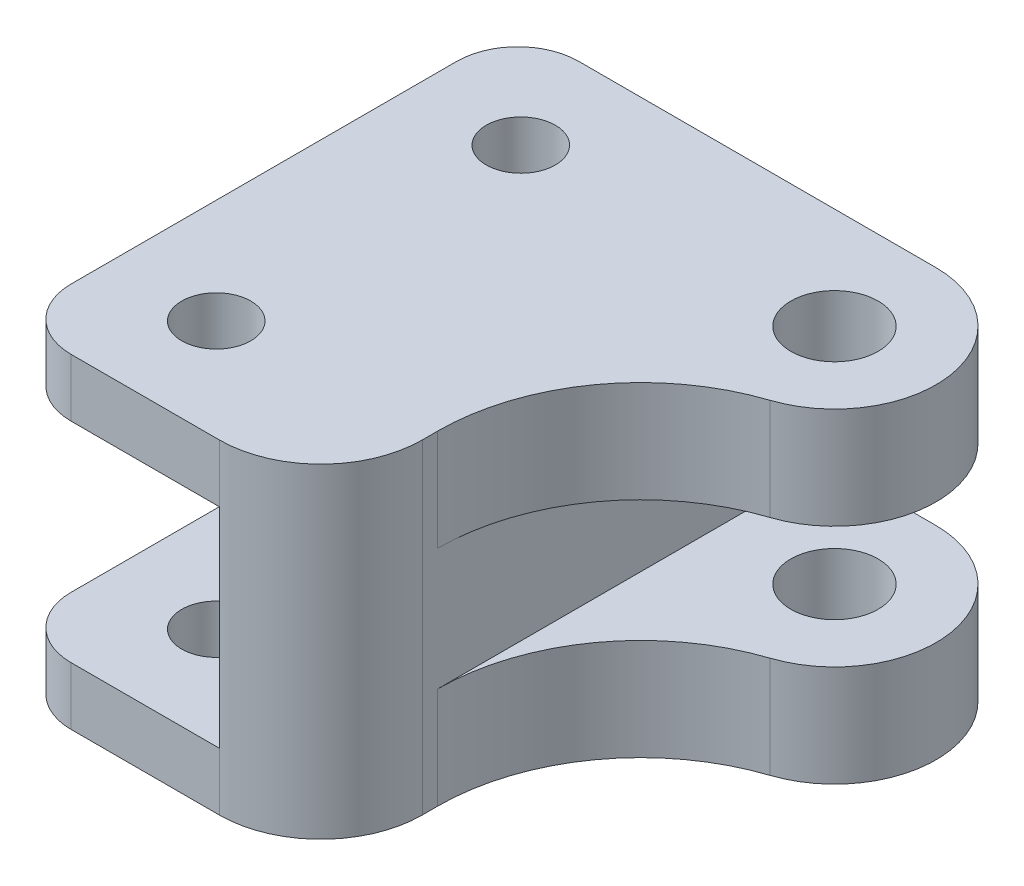
ISO-10303-21;
HEADER;
FILE_DESCRIPTION(('STEP AP214'),'2;1');
FILE_NAME('part.step','',(''),(''),'','','');
FILE_SCHEMA(('AUTOMOTIVE_DESIGN { 1 0 10303 214 1 1 1 1 }'));
ENDSEC;
DATA;
#1=APPLICATION_CONTEXT('core data for automotive mechanical design processes');
#2=APPLICATION_PROTOCOL_DEFINITION('international standard','automotive_design',2000,#1);
#3=PRODUCT_CONTEXT('',#1,'mechanical');
#4=PRODUCT('Part','Part','',(#3));
#5=PRODUCT_RELATED_PRODUCT_CATEGORY('part','',(#4));
#6=PRODUCT_DEFINITION_FORMATION('','',#4);
#7=PRODUCT_DEFINITION_CONTEXT('part definition',#1,'design');
#8=PRODUCT_DEFINITION('design','',#6,#7);
#9=PRODUCT_DEFINITION_SHAPE('','',#8);
#10=(LENGTH_UNIT() NAMED_UNIT(*) SI_UNIT(.MILLI.,.METRE.));
#11=(NAMED_UNIT(*) PLANE_ANGLE_UNIT() SI_UNIT($,.RADIAN.));
#12=(NAMED_UNIT(*) SI_UNIT($,.STERADIAN.) SOLID_ANGLE_UNIT());
#13=UNCERTAINTY_MEASURE_WITH_UNIT(LENGTH_MEASURE(1.E-05),#10,'distance_accuracy_value','');
#14=(GEOMETRIC_REPRESENTATION_CONTEXT(3) GLOBAL_UNCERTAINTY_ASSIGNED_CONTEXT((#13)) GLOBAL_UNIT_ASSIGNED_CONTEXT((#10,
#11,#12)) REPRESENTATION_CONTEXT('',''));
#15=CARTESIAN_POINT('',(0.,0.,0.));
#16=DIRECTION('',(0.,0.,1.));
#17=DIRECTION('',(1.,0.,0.));
#18=AXIS2_PLACEMENT_3D('',#15,#16,#17);
#19=CARTESIAN_POINT('',(0.,0.,25.));
#20=DIRECTION('',(0.,0.,1.));
#21=DIRECTION('',(1.,0.,0.));
#22=AXIS2_PLACEMENT_3D('',#19,#20,#21);
#23=PLANE('',#22);
#24=DIRECTION('',(-1.,0.,0.));
#25=VECTOR('',#24,1.);
#26=CARTESIAN_POINT('',(0.,-5.15,25.));
#27=LINE('',#26,#25);
#28=CARTESIAN_POINT('',(5.15,-5.15,25.));
#29=VERTEX_POINT('',#28);
#30=CARTESIAN_POINT('',(-2.15,-5.15,25.));
#31=VERTEX_POINT('',#30);
#32=EDGE_CURVE('E248',#29,#31,#27,.T.);
#33=ORIENTED_EDGE('',*,*,#32,.T.);
#34=DIRECTION('',(0.,1.,0.));
#35=VECTOR('',#34,1.);
#36=CARTESIAN_POINT('',(-2.15,0.,25.));
#37=LINE('',#36,#35);
#38=CARTESIAN_POINT('',(-2.15,-8.,25.));
#39=VERTEX_POINT('',#38);
#40=EDGE_CURVE('E48',#31,#39,#37,.F.);
#41=ORIENTED_EDGE('',*,*,#40,.T.);
#42=DIRECTION('',(1.,0.,0.));
#43=VECTOR('',#42,1.);
#44=CARTESIAN_POINT('',(0.,-8.,25.));
#45=LINE('',#44,#43);
#46=CARTESIAN_POINT('',(5.15,-8.,25.));
#47=VERTEX_POINT('',#46);
#48=EDGE_CURVE('E251',#39,#47,#45,.T.);
#49=ORIENTED_EDGE('',*,*,#48,.T.);
#50=DIRECTION('',(0.,1.,0.));
#51=VECTOR('',#50,1.);
#52=CARTESIAN_POINT('',(5.15,8.,25.));
#53=LINE('',#52,#51);
#54=EDGE_CURVE('E314',#47,#29,#53,.T.);
#55=ORIENTED_EDGE('',*,*,#54,.T.);
#56=EDGE_LOOP('',(#33,#41,#49,#55));
#57=FACE_BOUND('',#56,.T.);
#58=ADVANCED_FACE('F40',(#57),#23,.T.);
#59=CARTESIAN_POINT('',(0.,0.,0.));
#60=DIRECTION('',(0.,0.,1.));
#61=DIRECTION('',(1.,0.,0.));
#62=AXIS2_PLACEMENT_3D('',#59,#60,#61);
#63=PLANE('',#62);
#64=DIRECTION('',(-1.,0.,0.));
#65=VECTOR('',#64,1.);
#66=CARTESIAN_POINT('',(0.,5.15,0.));
#67=LINE('',#66,#65);
#68=CARTESIAN_POINT('',(5.15,5.15,0.));
#69=VERTEX_POINT('',#68);
#70=CARTESIAN_POINT('',(-2.15,5.15,0.));
#71=VERTEX_POINT('',#70);
#72=EDGE_CURVE('E249',#69,#71,#67,.T.);
#73=ORIENTED_EDGE('',*,*,#72,.T.);
#74=DIRECTION('',(0.,1.,0.));
#75=VECTOR('',#74,1.);
#76=CARTESIAN_POINT('',(-2.15,8.,0.));
#77=LINE('',#76,#75);
#78=CARTESIAN_POINT('',(-2.15,8.,0.));
#79=VERTEX_POINT('',#78);
#80=EDGE_CURVE('E327',#71,#79,#77,.T.);
#81=ORIENTED_EDGE('',*,*,#80,.T.);
#82=DIRECTION('',(1.,0.,0.));
#83=VECTOR('',#82,1.);
#84=CARTESIAN_POINT('',(0.,8.,0.));
#85=LINE('',#84,#83);
#86=CARTESIAN_POINT('',(15.45,8.,0.));
#87=VERTEX_POINT('',#86);
#88=EDGE_CURVE('E266',#79,#87,#85,.T.);
#89=ORIENTED_EDGE('',*,*,#88,.T.);
#90=DIRECTION('',(0.,-1.,0.));
#91=VECTOR('',#90,1.);
#92=CARTESIAN_POINT('',(15.45,8.,0.));
#93=LINE('',#92,#91);
#94=CARTESIAN_POINT('',(15.45,3.,0.));
#95=VERTEX_POINT('',#94);
#96=EDGE_CURVE('E200',#87,#95,#93,.T.);
#97=ORIENTED_EDGE('',*,*,#96,.T.);
#98=DIRECTION('',(1.,0.,0.));
#99=VECTOR('',#98,1.);
#100=CARTESIAN_POINT('',(0.,3.,0.));
#101=LINE('',#100,#99);
#102=CARTESIAN_POINT('',(10.15,3.,0.));
#103=VERTEX_POINT('',#102);
#104=EDGE_CURVE('E191',#103,#95,#101,.T.);
#105=ORIENTED_EDGE('',*,*,#104,.F.);
#106=DIRECTION('',(0.,-1.,0.));
#107=VECTOR('',#106,1.);
#108=CARTESIAN_POINT('',(10.15,0.,0.));
#109=LINE('',#108,#107);
#110=CARTESIAN_POINT('',(10.15,-3.,0.));
#111=VERTEX_POINT('',#110);
#112=EDGE_CURVE('E172',#103,#111,#109,.T.);
#113=ORIENTED_EDGE('',*,*,#112,.T.);
#114=DIRECTION('',(-1.,0.,0.));
#115=VECTOR('',#114,1.);
#116=CARTESIAN_POINT('',(0.,-3.,0.));
#117=LINE('',#116,#115);
#118=CARTESIAN_POINT('',(15.45,-3.,0.));
#119=VERTEX_POINT('',#118);
#120=EDGE_CURVE('E185',#119,#111,#117,.T.);
#121=ORIENTED_EDGE('',*,*,#120,.F.);
#122=CARTESIAN_POINT('',(15.45,-8.,0.));
#123=VERTEX_POINT('',#122);
#124=EDGE_CURVE('E219',#119,#123,#93,.T.);
#125=ORIENTED_EDGE('',*,*,#124,.T.);
#126=DIRECTION('',(1.,0.,0.));
#127=VECTOR('',#126,1.);
#128=CARTESIAN_POINT('',(0.,-8.,0.));
#129=LINE('',#128,#127);
#130=CARTESIAN_POINT('',(-2.15,-8.,0.));
#131=VERTEX_POINT('',#130);
#132=EDGE_CURVE('E264',#131,#123,#129,.T.);
#133=ORIENTED_EDGE('',*,*,#132,.F.);
#134=DIRECTION('',(0.,1.,0.));
#135=VECTOR('',#134,1.);
#136=CARTESIAN_POINT('',(-2.15,-5.15,0.));
#137=LINE('',#136,#135);
#138=CARTESIAN_POINT('',(-2.15,-5.15,0.));
#139=VERTEX_POINT('',#138);
#140=EDGE_CURVE('E324',#131,#139,#137,.T.);
#141=ORIENTED_EDGE('',*,*,#140,.T.);
#142=DIRECTION('',(-1.,0.,0.));
#143=VECTOR('',#142,1.);
#144=CARTESIAN_POINT('',(0.,-5.15,0.));
#145=LINE('',#144,#143);
#146=CARTESIAN_POINT('',(5.15,-5.15,0.));
#147=VERTEX_POINT('',#146);
#148=EDGE_CURVE('E261',#147,#139,#145,.T.);
#149=ORIENTED_EDGE('',*,*,#148,.F.);
#150=DIRECTION('',(0.,-1.,0.));
#151=VECTOR('',#150,1.);
#152=CARTESIAN_POINT('',(5.15,0.,0.));
#153=LINE('',#152,#151);
#154=EDGE_CURVE('E245',#69,#147,#153,.T.);
#155=ORIENTED_EDGE('',*,*,#154,.F.);
#156=EDGE_LOOP('',(#73,#81,#89,#97,#105,#113,#121,#125,#133,#141,#149,#155));
#157=FACE_BOUND('',#156,.T.);
#158=ADVANCED_FACE('F198',(#157),#63,.F.);
#159=CARTESIAN_POINT('',(15.45,8.,5.));
#160=DIRECTION('',(0.,-1.,0.));
#161=DIRECTION('',(0.,0.,-1.));
#162=AXIS2_PLACEMENT_3D('',#159,#160,#161);
#163=CYLINDRICAL_SURFACE('',#162,5.);
#164=CARTESIAN_POINT('',(15.45,-3.,5.));
#165=DIRECTION('',(0.,1.,0.));
#166=DIRECTION('',(0.,0.,1.));
#167=AXIS2_PLACEMENT_3D('',#164,#165,#166);
#168=CIRCLE('',#167,5.);
#169=CARTESIAN_POINT('',(17.0166666666667,-3.,9.74821603926733));
#170=VERTEX_POINT('',#169);
#171=EDGE_CURVE('E205',#119,#170,#168,.F.);
#172=ORIENTED_EDGE('',*,*,#171,.T.);
#173=DIRECTION('',(0.,-1.,0.));
#174=VECTOR('',#173,1.);
#175=CARTESIAN_POINT('',(17.0166666666667,8.,9.74821603926733));
#176=LINE('',#175,#174);
#177=CARTESIAN_POINT('',(17.0166666666667,-8.,9.74821603926733));
#178=VERTEX_POINT('',#177);
#179=EDGE_CURVE('E287',#170,#178,#176,.T.);
#180=ORIENTED_EDGE('',*,*,#179,.T.);
#181=CARTESIAN_POINT('',(15.45,-8.,5.));
#182=DIRECTION('',(0.,-1.,0.));
#183=DIRECTION('',(0.,0.,-1.));
#184=AXIS2_PLACEMENT_3D('',#181,#182,#183);
#185=CIRCLE('',#184,5.);
#186=EDGE_CURVE('E184',#123,#178,#185,.T.);
#187=ORIENTED_EDGE('',*,*,#186,.F.);
#188=ORIENTED_EDGE('',*,*,#124,.F.);
#189=EDGE_LOOP('',(#172,#180,#187,#188));
#190=FACE_BOUND('',#189,.T.);
#191=ADVANCED_FACE('F426',(#190),#163,.T.);
#192=CARTESIAN_POINT('',(15.45,8.,5.));
#193=DIRECTION('',(0.,-1.,0.));
#194=DIRECTION('',(0.,0.,-1.));
#195=AXIS2_PLACEMENT_3D('',#192,#193,#194);
#196=CIRCLE('',#195,5.);
#197=CARTESIAN_POINT('',(17.0166666666667,8.,9.74821603926733));
#198=VERTEX_POINT('',#197);
#199=EDGE_CURVE('E212',#87,#198,#196,.T.);
#200=ORIENTED_EDGE('',*,*,#199,.T.);
#201=DIRECTION('',(0.,-1.,0.));
#202=VECTOR('',#201,1.);
#203=CARTESIAN_POINT('',(17.0166666666667,8.,9.74821603926733));
#204=LINE('',#203,#202);
#205=CARTESIAN_POINT('',(17.0166666666667,3.,9.74821603926733));
#206=VERTEX_POINT('',#205);
#207=EDGE_CURVE('E300',#198,#206,#204,.T.);
#208=ORIENTED_EDGE('',*,*,#207,.T.);
#209=CARTESIAN_POINT('',(15.45,3.,5.));
#210=DIRECTION('',(0.,-1.,0.));
#211=DIRECTION('',(0.,0.,-1.));
#212=AXIS2_PLACEMENT_3D('',#209,#210,#211);
#213=CIRCLE('',#212,5.);
#214=EDGE_CURVE('E202',#206,#95,#213,.F.);
#215=ORIENTED_EDGE('',*,*,#214,.T.);
#216=ORIENTED_EDGE('',*,*,#96,.F.);
#217=EDGE_LOOP('',(#200,#208,#215,#216));
#218=FACE_BOUND('',#217,.T.);
#219=ADVANCED_FACE('F412',(#218),#163,.T.);
#220=CARTESIAN_POINT('',(15.45,8.,5.));
#221=DIRECTION('',(0.,-1.,0.));
#222=DIRECTION('',(0.,0.,-1.));
#223=AXIS2_PLACEMENT_3D('',#220,#221,#222);
#224=CYLINDRICAL_SURFACE('',#223,2.15);
#225=CARTESIAN_POINT('',(15.45,-8.,5.));
#226=DIRECTION('',(0.,-1.,0.));
#227=DIRECTION('',(0.,0.,-1.));
#228=AXIS2_PLACEMENT_3D('',#225,#226,#227);
#229=CIRCLE('',#228,2.15);
#230=CARTESIAN_POINT('',(15.45,-8.,2.85));
#231=VERTEX_POINT('',#230);
#232=EDGE_CURVE('E216',#231,#231,#229,.T.);
#233=ORIENTED_EDGE('',*,*,#232,.T.);
#234=EDGE_LOOP('',(#233));
#235=FACE_BOUND('',#234,.T.);
#236=CARTESIAN_POINT('',(15.45,-3.,5.));
#237=DIRECTION('',(0.,1.,0.));
#238=DIRECTION('',(0.,0.,1.));
#239=AXIS2_PLACEMENT_3D('',#236,#237,#238);
#240=CIRCLE('',#239,2.15);
#241=CARTESIAN_POINT('',(15.45,-3.,7.15));
#242=VERTEX_POINT('',#241);
#243=EDGE_CURVE('E201',#242,#242,#240,.F.);
#244=ORIENTED_EDGE('',*,*,#243,.F.);
#245=EDGE_LOOP('',(#244));
#246=FACE_BOUND('',#245,.T.);
#247=ADVANCED_FACE('F433',(#235,#246),#224,.F.);
#248=CARTESIAN_POINT('',(15.45,8.,5.));
#249=DIRECTION('',(0.,-1.,0.));
#250=DIRECTION('',(0.,0.,-1.));
#251=AXIS2_PLACEMENT_3D('',#248,#249,#250);
#252=CIRCLE('',#251,2.15);
#253=CARTESIAN_POINT('',(15.45,8.,2.85));
#254=VERTEX_POINT('',#253);
#255=EDGE_CURVE('E215',#254,#254,#252,.T.);
#256=ORIENTED_EDGE('',*,*,#255,.F.);
#257=EDGE_LOOP('',(#256));
#258=FACE_BOUND('',#257,.T.);
#259=CARTESIAN_POINT('',(15.45,3.,5.));
#260=DIRECTION('',(0.,-1.,0.));
#261=DIRECTION('',(0.,0.,-1.));
#262=AXIS2_PLACEMENT_3D('',#259,#260,#261);
#263=CIRCLE('',#262,2.15);
#264=CARTESIAN_POINT('',(15.45,3.,2.85));
#265=VERTEX_POINT('',#264);
#266=EDGE_CURVE('E195',#265,#265,#263,.F.);
#267=ORIENTED_EDGE('',*,*,#266,.F.);
#268=EDGE_LOOP('',(#267));
#269=FACE_BOUND('',#268,.T.);
#270=ADVANCED_FACE('F465',(#258,#269),#224,.F.);
#271=CARTESIAN_POINT('',(10.15,0.,25.));
#272=DIRECTION('',(-1.,0.,0.));
#273=DIRECTION('',(0.,-1.,0.));
#274=AXIS2_PLACEMENT_3D('',#271,#272,#273);
#275=PLANE('',#274);
#276=DIRECTION('',(0.,0.,-1.));
#277=VECTOR('',#276,1.);
#278=CARTESIAN_POINT('',(10.15,8.,25.));
#279=LINE('',#278,#277);
#280=CARTESIAN_POINT('',(10.15,8.,20.));
#281=VERTEX_POINT('',#280);
#282=CARTESIAN_POINT('',(10.15,8.,19.244648117802));
#283=VERTEX_POINT('',#282);
#284=EDGE_CURVE('E276',#281,#283,#279,.T.);
#285=ORIENTED_EDGE('',*,*,#284,.F.);
#286=DIRECTION('',(0.,1.,0.));
#287=VECTOR('',#286,1.);
#288=CARTESIAN_POINT('',(10.15,-8.,20.));
#289=LINE('',#288,#287);
#290=CARTESIAN_POINT('',(10.15,-8.,20.));
#291=VERTEX_POINT('',#290);
#292=EDGE_CURVE('E319',#281,#291,#289,.F.);
#293=ORIENTED_EDGE('',*,*,#292,.T.);
#294=DIRECTION('',(0.,0.,-1.));
#295=VECTOR('',#294,1.);
#296=CARTESIAN_POINT('',(10.15,-8.,25.));
#297=LINE('',#296,#295);
#298=CARTESIAN_POINT('',(10.15,-8.,19.244648117802));
#299=VERTEX_POINT('',#298);
#300=EDGE_CURVE('E278',#291,#299,#297,.T.);
#301=ORIENTED_EDGE('',*,*,#300,.T.);
#302=DIRECTION('',(0.,-1.,0.));
#303=VECTOR('',#302,1.);
#304=CARTESIAN_POINT('',(10.15,0.,19.244648117802));
#305=LINE('',#304,#303);
#306=CARTESIAN_POINT('',(10.15,-3.,19.244648117802));
#307=VERTEX_POINT('',#306);
#308=EDGE_CURVE('E298',#299,#307,#305,.F.);
#309=ORIENTED_EDGE('',*,*,#308,.T.);
#310=DIRECTION('',(0.,0.,-1.));
#311=VECTOR('',#310,1.);
#312=CARTESIAN_POINT('',(10.15,-3.,-10.));
#313=LINE('',#312,#311);
#314=EDGE_CURVE('E180',#307,#111,#313,.T.);
#315=ORIENTED_EDGE('',*,*,#314,.T.);
#316=ORIENTED_EDGE('',*,*,#112,.F.);
#317=DIRECTION('',(0.,0.,1.));
#318=VECTOR('',#317,1.);
#319=CARTESIAN_POINT('',(10.15,3.,-10.));
#320=LINE('',#319,#318);
#321=CARTESIAN_POINT('',(10.15,3.,19.244648117802));
#322=VERTEX_POINT('',#321);
#323=EDGE_CURVE('E177',#103,#322,#320,.T.);
#324=ORIENTED_EDGE('',*,*,#323,.T.);
#325=DIRECTION('',(0.,-1.,0.));
#326=VECTOR('',#325,1.);
#327=CARTESIAN_POINT('',(10.15,0.,19.244648117802));
#328=LINE('',#327,#326);
#329=EDGE_CURVE('E296',#322,#283,#328,.F.);
#330=ORIENTED_EDGE('',*,*,#329,.T.);
#331=EDGE_LOOP('',(#285,#293,#301,#309,#315,#316,#324,#330));
#332=FACE_BOUND('',#331,.T.);
#333=ADVANCED_FACE('F175',(#332),#275,.F.);
#334=CARTESIAN_POINT('',(5.15,0.,25.));
#335=DIRECTION('',(1.,0.,0.));
#336=DIRECTION('',(0.,1.,0.));
#337=AXIS2_PLACEMENT_3D('',#334,#335,#336);
#338=PLANE('',#337);
#339=ORIENTED_EDGE('',*,*,#154,.T.);
#340=DIRECTION('',(0.,0.,-1.));
#341=VECTOR('',#340,1.);
#342=CARTESIAN_POINT('',(5.15,-5.15,25.));
#343=LINE('',#342,#341);
#344=EDGE_CURVE('E284',#29,#147,#343,.T.);
#345=ORIENTED_EDGE('',*,*,#344,.F.);
#346=DIRECTION('',(0.,-1.,0.));
#347=VECTOR('',#346,1.);
#348=CARTESIAN_POINT('',(5.15,0.,25.));
#349=LINE('',#348,#347);
#350=CARTESIAN_POINT('',(5.15,5.15,25.));
#351=VERTEX_POINT('',#350);
#352=EDGE_CURVE('E246',#351,#29,#349,.T.);
#353=ORIENTED_EDGE('',*,*,#352,.F.);
#354=DIRECTION('',(0.,0.,-1.));
#355=VECTOR('',#354,1.);
#356=CARTESIAN_POINT('',(5.15,5.15,25.));
#357=LINE('',#356,#355);
#358=EDGE_CURVE('E258',#351,#69,#357,.T.);
#359=ORIENTED_EDGE('',*,*,#358,.T.);
#360=EDGE_LOOP('',(#339,#345,#353,#359));
#361=FACE_BOUND('',#360,.T.);
#362=ADVANCED_FACE('F385',(#361),#338,.F.);
#363=CARTESIAN_POINT('',(0.,-5.15,25.));
#364=DIRECTION('',(0.,-1.,0.));
#365=DIRECTION('',(1.,0.,0.));
#366=AXIS2_PLACEMENT_3D('',#363,#364,#365);
#367=PLANE('',#366);
#368=CARTESIAN_POINT('',(0.,-5.15,20.));
#369=DIRECTION('',(0.,-1.,0.));
#370=DIRECTION('',(1.,0.,0.));
#371=AXIS2_PLACEMENT_3D('',#368,#369,#370);
#372=CIRCLE('',#371,1.7);
#373=CARTESIAN_POINT('',(1.7,-5.15,20.));
#374=VERTEX_POINT('',#373);
#375=EDGE_CURVE('E242',#374,#374,#372,.T.);
#376=ORIENTED_EDGE('',*,*,#375,.T.);
#377=EDGE_LOOP('',(#376));
#378=FACE_BOUND('',#377,.T.);
#379=CARTESIAN_POINT('',(0.,-5.15,5.));
#380=DIRECTION('',(0.,-1.,0.));
#381=DIRECTION('',(1.,0.,0.));
#382=AXIS2_PLACEMENT_3D('',#379,#380,#381);
#383=CIRCLE('',#382,1.7);
#384=CARTESIAN_POINT('',(1.7,-5.15,5.));
#385=VERTEX_POINT('',#384);
#386=EDGE_CURVE('E238',#385,#385,#383,.T.);
#387=ORIENTED_EDGE('',*,*,#386,.T.);
#388=EDGE_LOOP('',(#387));
#389=FACE_BOUND('',#388,.T.);
#390=ORIENTED_EDGE('',*,*,#148,.T.);
#391=CARTESIAN_POINT('',(-2.15,-5.15,3.));
#392=DIRECTION('',(0.,-1.,0.));
#393=DIRECTION('',(1.,0.,0.));
#394=AXIS2_PLACEMENT_3D('',#391,#392,#393);
#395=CIRCLE('',#394,3.);
#396=CARTESIAN_POINT('',(-5.15,-5.15,3.));
#397=VERTEX_POINT('',#396);
#398=EDGE_CURVE('E345',#139,#397,#395,.F.);
#399=ORIENTED_EDGE('',*,*,#398,.T.);
#400=DIRECTION('',(0.,0.,-1.));
#401=VECTOR('',#400,1.);
#402=CARTESIAN_POINT('',(-5.15,-5.15,25.));
#403=LINE('',#402,#401);
#404=CARTESIAN_POINT('',(-5.15,-5.15,22.));
#405=VERTEX_POINT('',#404);
#406=EDGE_CURVE('E282',#405,#397,#403,.T.);
#407=ORIENTED_EDGE('',*,*,#406,.F.);
#408=CARTESIAN_POINT('',(-2.15,-5.15,22.));
#409=DIRECTION('',(0.,-1.,0.));
#410=DIRECTION('',(1.,0.,0.));
#411=AXIS2_PLACEMENT_3D('',#408,#409,#410);
#412=CIRCLE('',#411,3.);
#413=EDGE_CURVE('E343',#405,#31,#412,.F.);
#414=ORIENTED_EDGE('',*,*,#413,.T.);
#415=ORIENTED_EDGE('',*,*,#32,.F.);
#416=ORIENTED_EDGE('',*,*,#344,.T.);
#417=EDGE_LOOP('',(#390,#399,#407,#414,#415,#416));
#418=FACE_BOUND('',#417,.T.);
#419=ADVANCED_FACE('F367',(#378,#389,#418),#367,.F.);
#420=CARTESIAN_POINT('',(-5.15,0.,25.));
#421=DIRECTION('',(-1.,0.,0.));
#422=DIRECTION('',(0.,-1.,0.));
#423=AXIS2_PLACEMENT_3D('',#420,#421,#422);
#424=PLANE('',#423);
#425=ORIENTED_EDGE('',*,*,#406,.T.);
#426=DIRECTION('',(0.,1.,0.));
#427=VECTOR('',#426,1.);
#428=CARTESIAN_POINT('',(-5.15,-8.,3.));
#429=LINE('',#428,#427);
#430=CARTESIAN_POINT('',(-5.15,-8.,3.));
#431=VERTEX_POINT('',#430);
#432=EDGE_CURVE('E62',#397,#431,#429,.F.);
#433=ORIENTED_EDGE('',*,*,#432,.T.);
#434=DIRECTION('',(0.,0.,-1.));
#435=VECTOR('',#434,1.);
#436=CARTESIAN_POINT('',(-5.15,-8.,25.));
#437=LINE('',#436,#435);
#438=CARTESIAN_POINT('',(-5.15,-8.,22.));
#439=VERTEX_POINT('',#438);
#440=EDGE_CURVE('E280',#439,#431,#437,.T.);
#441=ORIENTED_EDGE('',*,*,#440,.F.);
#442=DIRECTION('',(0.,1.,0.));
#443=VECTOR('',#442,1.);
#444=CARTESIAN_POINT('',(-5.15,0.,22.));
#445=LINE('',#444,#443);
#446=EDGE_CURVE('E347',#439,#405,#445,.T.);
#447=ORIENTED_EDGE('',*,*,#446,.T.);
#448=EDGE_LOOP('',(#425,#433,#441,#447));
#449=FACE_BOUND('',#448,.T.);
#450=ADVANCED_FACE('F368',(#449),#424,.T.);
#451=CARTESIAN_POINT('',(0.,-8.,25.));
#452=DIRECTION('',(0.,1.,0.));
#453=DIRECTION('',(0.,0.,1.));
#454=AXIS2_PLACEMENT_3D('',#451,#452,#453);
#455=PLANE('',#454);
#456=CARTESIAN_POINT('',(0.,-8.,20.));
#457=DIRECTION('',(0.,-1.,0.));
#458=DIRECTION('',(0.,0.,-1.));
#459=AXIS2_PLACEMENT_3D('',#456,#457,#458);
#460=CIRCLE('',#459,1.7);
#461=CARTESIAN_POINT('',(0.,-8.,18.3));
#462=VERTEX_POINT('',#461);
#463=EDGE_CURVE('E230',#462,#462,#460,.T.);
#464=ORIENTED_EDGE('',*,*,#463,.F.);
#465=EDGE_LOOP('',(#464));
#466=FACE_BOUND('',#465,.T.);
#467=CARTESIAN_POINT('',(0.,-8.,5.));
#468=DIRECTION('',(0.,-1.,0.));
#469=DIRECTION('',(0.,0.,-1.));
#470=AXIS2_PLACEMENT_3D('',#467,#468,#469);
#471=CIRCLE('',#470,1.7);
#472=CARTESIAN_POINT('',(0.,-8.,3.3));
#473=VERTEX_POINT('',#472);
#474=EDGE_CURVE('E233',#473,#473,#471,.T.);
#475=ORIENTED_EDGE('',*,*,#474,.F.);
#476=EDGE_LOOP('',(#475));
#477=FACE_BOUND('',#476,.T.);
#478=ORIENTED_EDGE('',*,*,#440,.T.);
#479=CARTESIAN_POINT('',(-2.15,-8.,3.));
#480=DIRECTION('',(0.,1.,0.));
#481=DIRECTION('',(0.,0.,1.));
#482=AXIS2_PLACEMENT_3D('',#479,#480,#481);
#483=CIRCLE('',#482,3.);
#484=EDGE_CURVE('E353',#431,#131,#483,.F.);
#485=ORIENTED_EDGE('',*,*,#484,.T.);
#486=ORIENTED_EDGE('',*,*,#132,.T.);
#487=ORIENTED_EDGE('',*,*,#186,.T.);
#488=CARTESIAN_POINT('',(20.15,-8.,19.244648117802));
#489=DIRECTION('',(0.,1.,0.));
#490=DIRECTION('',(0.,0.,1.));
#491=AXIS2_PLACEMENT_3D('',#488,#489,#490);
#492=CIRCLE('',#491,10.);
#493=EDGE_CURVE('E303',#178,#299,#492,.T.);
#494=ORIENTED_EDGE('',*,*,#493,.T.);
#495=ORIENTED_EDGE('',*,*,#300,.F.);
#496=CARTESIAN_POINT('',(5.15,-8.,20.));
#497=DIRECTION('',(0.,1.,0.));
#498=DIRECTION('',(0.,0.,1.));
#499=AXIS2_PLACEMENT_3D('',#496,#497,#498);
#500=CIRCLE('',#499,5.);
#501=EDGE_CURVE('E321',#291,#47,#500,.F.);
#502=ORIENTED_EDGE('',*,*,#501,.T.);
#503=ORIENTED_EDGE('',*,*,#48,.F.);
#504=CARTESIAN_POINT('',(-2.15,-8.,22.));
#505=DIRECTION('',(0.,1.,0.));
#506=DIRECTION('',(0.,0.,1.));
#507=AXIS2_PLACEMENT_3D('',#504,#505,#506);
#508=CIRCLE('',#507,3.);
#509=EDGE_CURVE('E351',#39,#439,#508,.F.);
#510=ORIENTED_EDGE('',*,*,#509,.T.);
#511=EDGE_LOOP('',(#478,#485,#486,#487,#494,#495,#502,#503,#510));
#512=FACE_BOUND('',#511,.T.);
#513=ORIENTED_EDGE('',*,*,#232,.F.);
#514=EDGE_LOOP('',(#513));
#515=FACE_BOUND('',#514,.T.);
#516=ADVANCED_FACE('F357',(#466,#477,#512,#515),#455,.F.);
#517=CARTESIAN_POINT('',(0.,8.,25.));
#518=DIRECTION('',(0.,1.,0.));
#519=DIRECTION('',(-1.,0.,0.));
#520=AXIS2_PLACEMENT_3D('',#517,#518,#519);
#521=PLANE('',#520);
#522=CARTESIAN_POINT('',(0.,8.,20.));
#523=DIRECTION('',(0.,-1.,0.));
#524=DIRECTION('',(0.,0.,-1.));
#525=AXIS2_PLACEMENT_3D('',#522,#523,#524);
#526=CIRCLE('',#525,1.7);
#527=CARTESIAN_POINT('',(0.,8.,18.3));
#528=VERTEX_POINT('',#527);
#529=EDGE_CURVE('E226',#528,#528,#526,.T.);
#530=ORIENTED_EDGE('',*,*,#529,.T.);
#531=EDGE_LOOP('',(#530));
#532=FACE_BOUND('',#531,.T.);
#533=CARTESIAN_POINT('',(0.,8.,5.));
#534=DIRECTION('',(0.,-1.,0.));
#535=DIRECTION('',(0.,0.,-1.));
#536=AXIS2_PLACEMENT_3D('',#533,#534,#535);
#537=CIRCLE('',#536,1.7);
#538=CARTESIAN_POINT('',(0.,8.,3.3));
#539=VERTEX_POINT('',#538);
#540=EDGE_CURVE('E225',#539,#539,#537,.T.);
#541=ORIENTED_EDGE('',*,*,#540,.T.);
#542=EDGE_LOOP('',(#541));
#543=FACE_BOUND('',#542,.T.);
#544=ORIENTED_EDGE('',*,*,#88,.F.);
#545=CARTESIAN_POINT('',(-2.15,8.,3.));
#546=DIRECTION('',(0.,1.,0.));
#547=DIRECTION('',(-1.,0.,0.));
#548=AXIS2_PLACEMENT_3D('',#545,#546,#547);
#549=CIRCLE('',#548,3.);
#550=CARTESIAN_POINT('',(-5.15,8.,3.));
#551=VERTEX_POINT('',#550);
#552=EDGE_CURVE('E332',#79,#551,#549,.T.);
#553=ORIENTED_EDGE('',*,*,#552,.T.);
#554=DIRECTION('',(0.,0.,-1.));
#555=VECTOR('',#554,1.);
#556=CARTESIAN_POINT('',(-5.15,8.,25.));
#557=LINE('',#556,#555);
#558=CARTESIAN_POINT('',(-5.15,8.,22.));
#559=VERTEX_POINT('',#558);
#560=EDGE_CURVE('E273',#559,#551,#557,.T.);
#561=ORIENTED_EDGE('',*,*,#560,.F.);
#562=CARTESIAN_POINT('',(-2.15,8.,22.));
#563=DIRECTION('',(0.,1.,0.));
#564=DIRECTION('',(-1.,0.,0.));
#565=AXIS2_PLACEMENT_3D('',#562,#563,#564);
#566=CIRCLE('',#565,3.);
#567=CARTESIAN_POINT('',(-2.15,8.,25.));
#568=VERTEX_POINT('',#567);
#569=EDGE_CURVE('E330',#559,#568,#566,.T.);
#570=ORIENTED_EDGE('',*,*,#569,.T.);
#571=DIRECTION('',(1.,0.,0.));
#572=VECTOR('',#571,1.);
#573=CARTESIAN_POINT('',(0.,8.,25.));
#574=LINE('',#573,#572);
#575=CARTESIAN_POINT('',(5.15,8.,25.));
#576=VERTEX_POINT('',#575);
#577=EDGE_CURVE('E253',#568,#576,#574,.T.);
#578=ORIENTED_EDGE('',*,*,#577,.T.);
#579=CARTESIAN_POINT('',(5.15,8.,20.));
#580=DIRECTION('',(0.,1.,0.));
#581=DIRECTION('',(-1.,0.,0.));
#582=AXIS2_PLACEMENT_3D('',#579,#580,#581);
#583=CIRCLE('',#582,5.);
#584=EDGE_CURVE('E317',#576,#281,#583,.T.);
#585=ORIENTED_EDGE('',*,*,#584,.T.);
#586=ORIENTED_EDGE('',*,*,#284,.T.);
#587=CARTESIAN_POINT('',(20.15,8.00000000000001,19.244648117802));
#588=DIRECTION('',(0.,1.,0.));
#589=DIRECTION('',(-1.,0.,0.));
#590=AXIS2_PLACEMENT_3D('',#587,#588,#589);
#591=CIRCLE('',#590,10.);
#592=EDGE_CURVE('E309',#283,#198,#591,.F.);
#593=ORIENTED_EDGE('',*,*,#592,.T.);
#594=ORIENTED_EDGE('',*,*,#199,.F.);
#595=EDGE_LOOP('',(#544,#553,#561,#570,#578,#585,#586,#593,#594));
#596=FACE_BOUND('',#595,.T.);
#597=ORIENTED_EDGE('',*,*,#255,.T.);
#598=EDGE_LOOP('',(#597));
#599=FACE_BOUND('',#598,.T.);
#600=ADVANCED_FACE('F404',(#532,#543,#596,#599),#521,.T.);
#601=CARTESIAN_POINT('',(-5.15,0.,25.));
#602=DIRECTION('',(-1.,0.,0.));
#603=DIRECTION('',(0.,-1.,0.));
#604=AXIS2_PLACEMENT_3D('',#601,#602,#603);
#605=PLANE('',#604);
#606=ORIENTED_EDGE('',*,*,#560,.T.);
#607=DIRECTION('',(0.,1.,0.));
#608=VECTOR('',#607,1.);
#609=CARTESIAN_POINT('',(-5.15,5.15,3.));
#610=LINE('',#609,#608);
#611=CARTESIAN_POINT('',(-5.15,5.15,3.));
#612=VERTEX_POINT('',#611);
#613=EDGE_CURVE('E337',#551,#612,#610,.F.);
#614=ORIENTED_EDGE('',*,*,#613,.T.);
#615=DIRECTION('',(0.,0.,-1.));
#616=VECTOR('',#615,1.);
#617=CARTESIAN_POINT('',(-5.15,5.15,25.));
#618=LINE('',#617,#616);
#619=CARTESIAN_POINT('',(-5.15,5.15,22.));
#620=VERTEX_POINT('',#619);
#621=EDGE_CURVE('E270',#620,#612,#618,.T.);
#622=ORIENTED_EDGE('',*,*,#621,.F.);
#623=DIRECTION('',(0.,1.,0.));
#624=VECTOR('',#623,1.);
#625=CARTESIAN_POINT('',(-5.15,0.,22.));
#626=LINE('',#625,#624);
#627=EDGE_CURVE('E334',#620,#559,#626,.T.);
#628=ORIENTED_EDGE('',*,*,#627,.T.);
#629=EDGE_LOOP('',(#606,#614,#622,#628));
#630=FACE_BOUND('',#629,.T.);
#631=ADVANCED_FACE('F400',(#630),#605,.T.);
#632=CARTESIAN_POINT('',(0.,5.15,25.));
#633=DIRECTION('',(0.,-1.,0.));
#634=DIRECTION('',(1.,0.,0.));
#635=AXIS2_PLACEMENT_3D('',#632,#633,#634);
#636=PLANE('',#635);
#637=CARTESIAN_POINT('',(0.,5.15,20.));
#638=DIRECTION('',(0.,-1.,0.));
#639=DIRECTION('',(1.,0.,0.));
#640=AXIS2_PLACEMENT_3D('',#637,#638,#639);
#641=CIRCLE('',#640,1.7);
#642=CARTESIAN_POINT('',(1.7,5.15,20.));
#643=VERTEX_POINT('',#642);
#644=EDGE_CURVE('E241',#643,#643,#641,.T.);
#645=ORIENTED_EDGE('',*,*,#644,.F.);
#646=EDGE_LOOP('',(#645));
#647=FACE_BOUND('',#646,.T.);
#648=CARTESIAN_POINT('',(0.,5.15,5.));
#649=DIRECTION('',(0.,-1.,0.));
#650=DIRECTION('',(1.,0.,0.));
#651=AXIS2_PLACEMENT_3D('',#648,#649,#650);
#652=CIRCLE('',#651,1.7);
#653=CARTESIAN_POINT('',(1.7,5.15,5.));
#654=VERTEX_POINT('',#653);
#655=EDGE_CURVE('E229',#654,#654,#652,.T.);
#656=ORIENTED_EDGE('',*,*,#655,.F.);
#657=EDGE_LOOP('',(#656));
#658=FACE_BOUND('',#657,.T.);
#659=ORIENTED_EDGE('',*,*,#621,.T.);
#660=CARTESIAN_POINT('',(-2.15,5.15,3.));
#661=DIRECTION('',(0.,-1.,0.));
#662=DIRECTION('',(1.,0.,0.));
#663=AXIS2_PLACEMENT_3D('',#660,#661,#662);
#664=CIRCLE('',#663,3.);
#665=EDGE_CURVE('E341',#612,#71,#664,.T.);
#666=ORIENTED_EDGE('',*,*,#665,.T.);
#667=ORIENTED_EDGE('',*,*,#72,.F.);
#668=ORIENTED_EDGE('',*,*,#358,.F.);
#669=DIRECTION('',(-1.,0.,0.));
#670=VECTOR('',#669,1.);
#671=CARTESIAN_POINT('',(0.,5.15,25.));
#672=LINE('',#671,#670);
#673=CARTESIAN_POINT('',(-2.15,5.15,25.));
#674=VERTEX_POINT('',#673);
#675=EDGE_CURVE('E255',#351,#674,#672,.T.);
#676=ORIENTED_EDGE('',*,*,#675,.T.);
#677=CARTESIAN_POINT('',(-2.15,5.15,22.));
#678=DIRECTION('',(0.,-1.,0.));
#679=DIRECTION('',(1.,0.,0.));
#680=AXIS2_PLACEMENT_3D('',#677,#678,#679);
#681=CIRCLE('',#680,3.);
#682=EDGE_CURVE('E339',#674,#620,#681,.T.);
#683=ORIENTED_EDGE('',*,*,#682,.T.);
#684=EDGE_LOOP('',(#659,#666,#667,#668,#676,#683));
#685=FACE_BOUND('',#684,.T.);
#686=ADVANCED_FACE('F393',(#647,#658,#685),#636,.T.);
#687=ORIENTED_EDGE('',*,*,#577,.F.);
#688=DIRECTION('',(0.,1.,0.));
#689=VECTOR('',#688,1.);
#690=CARTESIAN_POINT('',(-2.15,0.,25.));
#691=LINE('',#690,#689);
#692=EDGE_CURVE('E11',#568,#674,#691,.F.);
#693=ORIENTED_EDGE('',*,*,#692,.T.);
#694=ORIENTED_EDGE('',*,*,#675,.F.);
#695=DIRECTION('',(0.,1.,0.));
#696=VECTOR('',#695,1.);
#697=CARTESIAN_POINT('',(5.15,8.,25.));
#698=LINE('',#697,#696);
#699=EDGE_CURVE('E311',#351,#576,#698,.T.);
#700=ORIENTED_EDGE('',*,*,#699,.T.);
#701=EDGE_LOOP('',(#687,#693,#694,#700));
#702=FACE_BOUND('',#701,.T.);
#703=ADVANCED_FACE('F389',(#702),#23,.T.);
#704=CARTESIAN_POINT('',(0.,8.,5.));
#705=DIRECTION('',(0.,-1.,0.));
#706=DIRECTION('',(0.,0.,-1.));
#707=AXIS2_PLACEMENT_3D('',#704,#705,#706);
#708=CYLINDRICAL_SURFACE('',#707,1.7);
#709=ORIENTED_EDGE('',*,*,#655,.T.);
#710=EDGE_LOOP('',(#709));
#711=FACE_BOUND('',#710,.T.);
#712=ORIENTED_EDGE('',*,*,#540,.F.);
#713=EDGE_LOOP('',(#712));
#714=FACE_BOUND('',#713,.T.);
#715=ADVANCED_FACE('F443',(#711,#714),#708,.F.);
#716=CARTESIAN_POINT('',(0.,8.,20.));
#717=DIRECTION('',(0.,-1.,0.));
#718=DIRECTION('',(0.,0.,-1.));
#719=AXIS2_PLACEMENT_3D('',#716,#717,#718);
#720=CYLINDRICAL_SURFACE('',#719,1.7);
#721=ORIENTED_EDGE('',*,*,#644,.T.);
#722=EDGE_LOOP('',(#721));
#723=FACE_BOUND('',#722,.T.);
#724=ORIENTED_EDGE('',*,*,#529,.F.);
#725=EDGE_LOOP('',(#724));
#726=FACE_BOUND('',#725,.T.);
#727=ADVANCED_FACE('F448',(#723,#726),#720,.F.);
#728=ORIENTED_EDGE('',*,*,#474,.T.);
#729=EDGE_LOOP('',(#728));
#730=FACE_BOUND('',#729,.T.);
#731=ORIENTED_EDGE('',*,*,#386,.F.);
#732=EDGE_LOOP('',(#731));
#733=FACE_BOUND('',#732,.T.);
#734=ADVANCED_FACE('F450',(#730,#733),#708,.F.);
#735=ORIENTED_EDGE('',*,*,#463,.T.);
#736=EDGE_LOOP('',(#735));
#737=FACE_BOUND('',#736,.T.);
#738=ORIENTED_EDGE('',*,*,#375,.F.);
#739=EDGE_LOOP('',(#738));
#740=FACE_BOUND('',#739,.T.);
#741=ADVANCED_FACE('F615',(#737,#740),#720,.F.);
#742=CARTESIAN_POINT('',(20.45,-3.,-10.));
#743=DIRECTION('',(0.,1.,0.));
#744=DIRECTION('',(0.,0.,1.));
#745=AXIS2_PLACEMENT_3D('',#742,#743,#744);
#746=PLANE('',#745);
#747=ORIENTED_EDGE('',*,*,#243,.T.);
#748=EDGE_LOOP('',(#747));
#749=FACE_BOUND('',#748,.T.);
#750=ORIENTED_EDGE('',*,*,#120,.T.);
#751=ORIENTED_EDGE('',*,*,#314,.F.);
#752=CARTESIAN_POINT('',(20.15,-3.,19.244648117802));
#753=DIRECTION('',(0.,1.,0.));
#754=DIRECTION('',(0.,0.,1.));
#755=AXIS2_PLACEMENT_3D('',#752,#753,#754);
#756=CIRCLE('',#755,10.);
#757=EDGE_CURVE('E306',#307,#170,#756,.F.);
#758=ORIENTED_EDGE('',*,*,#757,.T.);
#759=ORIENTED_EDGE('',*,*,#171,.F.);
#760=EDGE_LOOP('',(#750,#751,#758,#759));
#761=FACE_BOUND('',#760,.T.);
#762=ADVANCED_FACE('F424',(#749,#761),#746,.T.);
#763=CARTESIAN_POINT('',(20.45,3.,-10.));
#764=DIRECTION('',(0.,-1.,0.));
#765=DIRECTION('',(0.,0.,-1.));
#766=AXIS2_PLACEMENT_3D('',#763,#764,#765);
#767=PLANE('',#766);
#768=ORIENTED_EDGE('',*,*,#266,.T.);
#769=EDGE_LOOP('',(#768));
#770=FACE_BOUND('',#769,.T.);
#771=ORIENTED_EDGE('',*,*,#104,.T.);
#772=ORIENTED_EDGE('',*,*,#214,.F.);
#773=CARTESIAN_POINT('',(20.15,3.,19.244648117802));
#774=DIRECTION('',(0.,-1.,0.));
#775=DIRECTION('',(0.,0.,-1.));
#776=AXIS2_PLACEMENT_3D('',#773,#774,#775);
#777=CIRCLE('',#776,10.);
#778=EDGE_CURVE('E193',#206,#322,#777,.F.);
#779=ORIENTED_EDGE('',*,*,#778,.T.);
#780=ORIENTED_EDGE('',*,*,#323,.F.);
#781=EDGE_LOOP('',(#771,#772,#779,#780));
#782=FACE_BOUND('',#781,.T.);
#783=ADVANCED_FACE('F189',(#770,#782),#767,.T.);
#784=CARTESIAN_POINT('',(20.15,8.,19.244648117802));
#785=DIRECTION('',(0.,-1.,0.));
#786=DIRECTION('',(0.,0.,-1.));
#787=AXIS2_PLACEMENT_3D('',#784,#785,#786);
#788=CYLINDRICAL_SURFACE('',#787,10.);
#789=ORIENTED_EDGE('',*,*,#757,.F.);
#790=ORIENTED_EDGE('',*,*,#308,.F.);
#791=ORIENTED_EDGE('',*,*,#493,.F.);
#792=ORIENTED_EDGE('',*,*,#179,.F.);
#793=EDGE_LOOP('',(#789,#790,#791,#792));
#794=FACE_BOUND('',#793,.T.);
#795=ADVANCED_FACE('F422',(#794),#788,.F.);
#796=CARTESIAN_POINT('',(20.15,8.,19.244648117802));
#797=DIRECTION('',(0.,-1.,0.));
#798=DIRECTION('',(0.,0.,-1.));
#799=AXIS2_PLACEMENT_3D('',#796,#797,#798);
#800=CYLINDRICAL_SURFACE('',#799,10.);
#801=ORIENTED_EDGE('',*,*,#592,.F.);
#802=ORIENTED_EDGE('',*,*,#329,.F.);
#803=ORIENTED_EDGE('',*,*,#778,.F.);
#804=ORIENTED_EDGE('',*,*,#207,.F.);
#805=EDGE_LOOP('',(#801,#802,#803,#804));
#806=FACE_BOUND('',#805,.T.);
#807=ADVANCED_FACE('F416',(#806),#800,.F.);
#808=CARTESIAN_POINT('',(5.15,0.,20.));
#809=DIRECTION('',(0.,-1.,0.));
#810=DIRECTION('',(1.,0.,0.));
#811=AXIS2_PLACEMENT_3D('',#808,#809,#810);
#812=CYLINDRICAL_SURFACE('',#811,5.);
#813=ORIENTED_EDGE('',*,*,#501,.F.);
#814=ORIENTED_EDGE('',*,*,#292,.F.);
#815=ORIENTED_EDGE('',*,*,#584,.F.);
#816=ORIENTED_EDGE('',*,*,#699,.F.);
#817=ORIENTED_EDGE('',*,*,#352,.T.);
#818=ORIENTED_EDGE('',*,*,#54,.F.);
#819=EDGE_LOOP('',(#813,#814,#815,#816,#817,#818));
#820=FACE_BOUND('',#819,.T.);
#821=ADVANCED_FACE('F378',(#820),#812,.T.);
#822=CARTESIAN_POINT('',(-2.15,0.,3.));
#823=DIRECTION('',(0.,-1.,0.));
#824=DIRECTION('',(1.,0.,0.));
#825=AXIS2_PLACEMENT_3D('',#822,#823,#824);
#826=CYLINDRICAL_SURFACE('',#825,3.);
#827=ORIENTED_EDGE('',*,*,#665,.F.);
#828=ORIENTED_EDGE('',*,*,#613,.F.);
#829=ORIENTED_EDGE('',*,*,#552,.F.);
#830=ORIENTED_EDGE('',*,*,#80,.F.);
#831=EDGE_LOOP('',(#827,#828,#829,#830));
#832=FACE_BOUND('',#831,.T.);
#833=ADVANCED_FACE('F410',(#832),#826,.T.);
#834=CARTESIAN_POINT('',(-2.15,0.,3.));
#835=DIRECTION('',(0.,-1.,0.));
#836=DIRECTION('',(1.,0.,0.));
#837=AXIS2_PLACEMENT_3D('',#834,#835,#836);
#838=CYLINDRICAL_SURFACE('',#837,3.);
#839=ORIENTED_EDGE('',*,*,#484,.F.);
#840=ORIENTED_EDGE('',*,*,#432,.F.);
#841=ORIENTED_EDGE('',*,*,#398,.F.);
#842=ORIENTED_EDGE('',*,*,#140,.F.);
#843=EDGE_LOOP('',(#839,#840,#841,#842));
#844=FACE_BOUND('',#843,.T.);
#845=ADVANCED_FACE('F364',(#844),#838,.T.);
#846=CARTESIAN_POINT('',(-2.15,0.,22.));
#847=DIRECTION('',(0.,1.,0.));
#848=DIRECTION('',(-1.,0.,0.));
#849=AXIS2_PLACEMENT_3D('',#846,#847,#848);
#850=CYLINDRICAL_SURFACE('',#849,3.);
#851=ORIENTED_EDGE('',*,*,#509,.F.);
#852=ORIENTED_EDGE('',*,*,#40,.F.);
#853=ORIENTED_EDGE('',*,*,#413,.F.);
#854=ORIENTED_EDGE('',*,*,#446,.F.);
#855=EDGE_LOOP('',(#851,#852,#853,#854));
#856=FACE_BOUND('',#855,.T.);
#857=ADVANCED_FACE('F372',(#856),#850,.T.);
#858=CARTESIAN_POINT('',(-2.15,0.,22.));
#859=DIRECTION('',(0.,1.,0.));
#860=DIRECTION('',(-1.,0.,0.));
#861=AXIS2_PLACEMENT_3D('',#858,#859,#860);
#862=CYLINDRICAL_SURFACE('',#861,3.);
#863=ORIENTED_EDGE('',*,*,#682,.F.);
#864=ORIENTED_EDGE('',*,*,#692,.F.);
#865=ORIENTED_EDGE('',*,*,#569,.F.);
#866=ORIENTED_EDGE('',*,*,#627,.F.);
#867=EDGE_LOOP('',(#863,#864,#865,#866));
#868=FACE_BOUND('',#867,.T.);
#869=ADVANCED_FACE('F42',(#868),#862,.T.);
#870=CLOSED_SHELL('',(#58,#158,#191,#219,#247,#270,#333,#362,#419,#450,#516,#600,#631,#686,#703,
#715,#727,#734,#741,#762,#783,#795,#807,#821,#833,#845,#857,#869));
#871=MANIFOLD_SOLID_BREP('B2',#870);
#872=ADVANCED_BREP_SHAPE_REPRESENTATION('',(#18,#871),#14);
#873=SHAPE_DEFINITION_REPRESENTATION(#9,#872);
ENDSEC;
END-ISO-10303-21;
